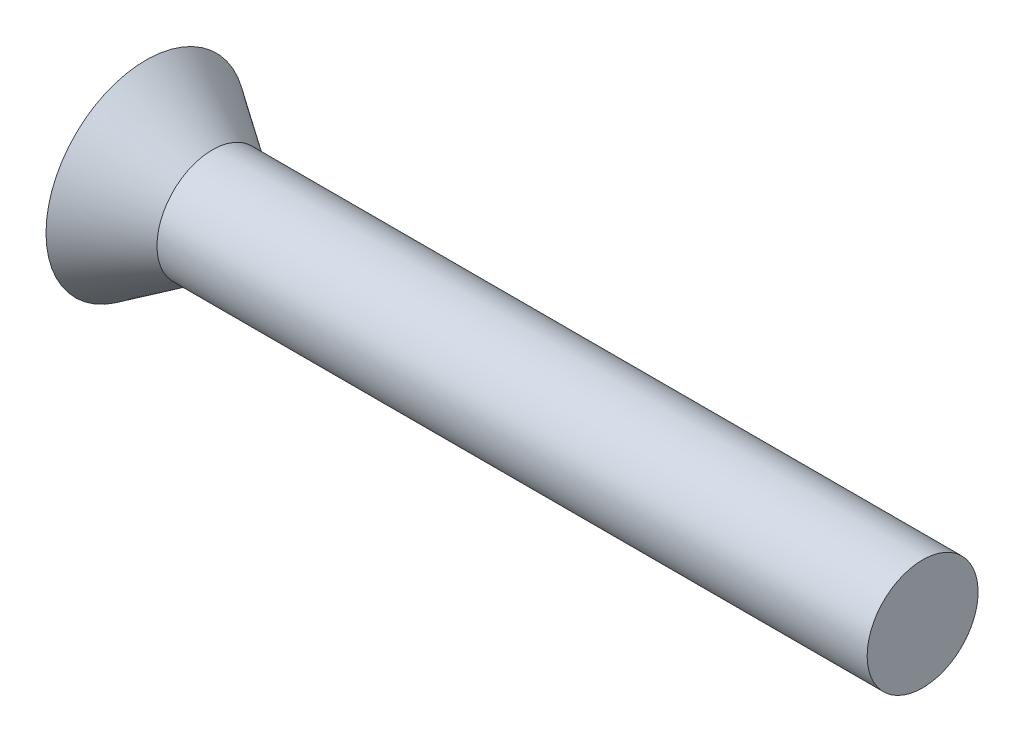
ISO-10303-21;
HEADER;
FILE_DESCRIPTION(('STEP AP214'),'2;1');
FILE_NAME('part.step','',(''),(''),'','','');
FILE_SCHEMA(('AUTOMOTIVE_DESIGN { 1 0 10303 214 1 1 1 1 }'));
ENDSEC;
DATA;
#1=APPLICATION_CONTEXT('core data for automotive mechanical design processes');
#2=APPLICATION_PROTOCOL_DEFINITION('international standard','automotive_design',2000,#1);
#3=PRODUCT_CONTEXT('',#1,'mechanical');
#4=PRODUCT('Part','Part','',(#3));
#5=PRODUCT_RELATED_PRODUCT_CATEGORY('part','',(#4));
#6=PRODUCT_DEFINITION_FORMATION('','',#4);
#7=PRODUCT_DEFINITION_CONTEXT('part definition',#1,'design');
#8=PRODUCT_DEFINITION('design','',#6,#7);
#9=PRODUCT_DEFINITION_SHAPE('','',#8);
#10=(LENGTH_UNIT() NAMED_UNIT(*) SI_UNIT(.MILLI.,.METRE.));
#11=(NAMED_UNIT(*) PLANE_ANGLE_UNIT() SI_UNIT($,.RADIAN.));
#12=(NAMED_UNIT(*) SI_UNIT($,.STERADIAN.) SOLID_ANGLE_UNIT());
#13=UNCERTAINTY_MEASURE_WITH_UNIT(LENGTH_MEASURE(1.E-05),#10,'distance_accuracy_value','');
#14=(GEOMETRIC_REPRESENTATION_CONTEXT(3) GLOBAL_UNCERTAINTY_ASSIGNED_CONTEXT((#13)) GLOBAL_UNIT_ASSIGNED_CONTEXT((#10,
#11,#12)) REPRESENTATION_CONTEXT('',''));
#15=CARTESIAN_POINT('',(0.,0.,0.));
#16=DIRECTION('',(0.,0.,1.));
#17=DIRECTION('',(1.,0.,0.));
#18=AXIS2_PLACEMENT_3D('',#15,#16,#17);
#19=CARTESIAN_POINT('',(-35.,0.,0.));
#20=DIRECTION('',(1.,0.,0.));
#21=DIRECTION('',(0.,0.,-1.));
#22=AXIS2_PLACEMENT_3D('',#19,#20,#21);
#23=PLANE('',#22);
#24=DIRECTION('',(0.,0.,1.));
#25=VECTOR('',#24,1.);
#26=CARTESIAN_POINT('',(-35.,0.5,0.));
#27=LINE('',#26,#25);
#28=CARTESIAN_POINT('',(-35.,0.5,-2.25));
#29=VERTEX_POINT('',#28);
#30=CARTESIAN_POINT('',(-35.,0.5,-0.5));
#31=VERTEX_POINT('',#30);
#32=EDGE_CURVE('E159',#29,#31,#27,.T.);
#33=ORIENTED_EDGE('',*,*,#32,.T.);
#34=DIRECTION('',(0.,-1.,0.));
#35=VECTOR('',#34,1.);
#36=CARTESIAN_POINT('',(-35.,0.,-0.5));
#37=LINE('',#36,#35);
#38=CARTESIAN_POINT('',(-35.,2.25,-0.5));
#39=VERTEX_POINT('',#38);
#40=EDGE_CURVE('E47',#39,#31,#37,.T.);
#41=ORIENTED_EDGE('',*,*,#40,.F.);
#42=DIRECTION('',(0.,0.,1.));
#43=VECTOR('',#42,1.);
#44=CARTESIAN_POINT('',(-35.,2.25,0.));
#45=LINE('',#44,#43);
#46=CARTESIAN_POINT('',(-35.,2.25,0.5));
#47=VERTEX_POINT('',#46);
#48=EDGE_CURVE('E186',#39,#47,#45,.T.);
#49=ORIENTED_EDGE('',*,*,#48,.T.);
#50=DIRECTION('',(0.,-1.,0.));
#51=VECTOR('',#50,1.);
#52=CARTESIAN_POINT('',(-35.,0.,0.5));
#53=LINE('',#52,#51);
#54=CARTESIAN_POINT('',(-35.,0.5,0.5));
#55=VERTEX_POINT('',#54);
#56=EDGE_CURVE('E184',#47,#55,#53,.T.);
#57=ORIENTED_EDGE('',*,*,#56,.T.);
#58=DIRECTION('',(0.,0.,1.));
#59=VECTOR('',#58,1.);
#60=CARTESIAN_POINT('',(-35.,0.5,0.));
#61=LINE('',#60,#59);
#62=CARTESIAN_POINT('',(-35.,0.5,2.25));
#63=VERTEX_POINT('',#62);
#64=EDGE_CURVE('E142',#55,#63,#61,.T.);
#65=ORIENTED_EDGE('',*,*,#64,.T.);
#66=DIRECTION('',(0.,-1.,0.));
#67=VECTOR('',#66,1.);
#68=CARTESIAN_POINT('',(-35.,0.,2.25));
#69=LINE('',#68,#67);
#70=CARTESIAN_POINT('',(-35.,-0.5,2.25));
#71=VERTEX_POINT('',#70);
#72=EDGE_CURVE('E180',#63,#71,#69,.T.);
#73=ORIENTED_EDGE('',*,*,#72,.T.);
#74=DIRECTION('',(0.,0.,1.));
#75=VECTOR('',#74,1.);
#76=CARTESIAN_POINT('',(-35.,-0.5,0.));
#77=LINE('',#76,#75);
#78=CARTESIAN_POINT('',(-35.,-0.5,0.5));
#79=VERTEX_POINT('',#78);
#80=EDGE_CURVE('E177',#79,#71,#77,.T.);
#81=ORIENTED_EDGE('',*,*,#80,.F.);
#82=DIRECTION('',(0.,-1.,0.));
#83=VECTOR('',#82,1.);
#84=CARTESIAN_POINT('',(-35.,0.,0.5));
#85=LINE('',#84,#83);
#86=CARTESIAN_POINT('',(-35.,-2.25,0.5));
#87=VERTEX_POINT('',#86);
#88=EDGE_CURVE('E174',#79,#87,#85,.T.);
#89=ORIENTED_EDGE('',*,*,#88,.T.);
#90=DIRECTION('',(0.,0.,1.));
#91=VECTOR('',#90,1.);
#92=CARTESIAN_POINT('',(-35.,-2.25,0.));
#93=LINE('',#92,#91);
#94=CARTESIAN_POINT('',(-35.,-2.25,-0.5));
#95=VERTEX_POINT('',#94);
#96=EDGE_CURVE('E171',#95,#87,#93,.T.);
#97=ORIENTED_EDGE('',*,*,#96,.F.);
#98=DIRECTION('',(0.,-1.,0.));
#99=VECTOR('',#98,1.);
#100=CARTESIAN_POINT('',(-35.,0.,-0.5));
#101=LINE('',#100,#99);
#102=CARTESIAN_POINT('',(-35.,-0.5,-0.5));
#103=VERTEX_POINT('',#102);
#104=EDGE_CURVE('E168',#103,#95,#101,.T.);
#105=ORIENTED_EDGE('',*,*,#104,.F.);
#106=DIRECTION('',(0.,0.,1.));
#107=VECTOR('',#106,1.);
#108=CARTESIAN_POINT('',(-35.,-0.5,0.));
#109=LINE('',#108,#107);
#110=CARTESIAN_POINT('',(-35.,-0.5,-2.25));
#111=VERTEX_POINT('',#110);
#112=EDGE_CURVE('E165',#111,#103,#109,.T.);
#113=ORIENTED_EDGE('',*,*,#112,.F.);
#114=DIRECTION('',(0.,-1.,0.));
#115=VECTOR('',#114,1.);
#116=CARTESIAN_POINT('',(-35.,0.,-2.25));
#117=LINE('',#116,#115);
#118=EDGE_CURVE('E162',#29,#111,#117,.T.);
#119=ORIENTED_EDGE('',*,*,#118,.F.);
#120=EDGE_LOOP('',(#33,#41,#49,#57,#65,#73,#81,#89,#97,#105,#113,#119));
#121=FACE_BOUND('',#120,.T.);
#122=CARTESIAN_POINT('',(-35.,0.,0.));
#123=DIRECTION('',(-1.,0.,0.));
#124=DIRECTION('',(0.,0.,1.));
#125=AXIS2_PLACEMENT_3D('',#122,#123,#124);
#126=CIRCLE('',#125,4.5);
#127=CARTESIAN_POINT('',(-35.,0.,4.5));
#128=VERTEX_POINT('',#127);
#129=EDGE_CURVE('E11',#128,#128,#126,.T.);
#130=ORIENTED_EDGE('',*,*,#129,.T.);
#131=EDGE_LOOP('',(#130));
#132=FACE_BOUND('',#131,.T.);
#133=ADVANCED_FACE('F33',(#121,#132),#23,.F.);
#134=CARTESIAN_POINT('',(-32.,0.,0.));
#135=DIRECTION('',(-1.,0.,0.));
#136=DIRECTION('',(0.,0.,1.));
#137=AXIS2_PLACEMENT_3D('',#134,#135,#136);
#138=CONICAL_SURFACE('',#137,2.5,0.588002603547567);
#139=ORIENTED_EDGE('',*,*,#129,.F.);
#140=EDGE_LOOP('',(#139));
#141=FACE_BOUND('',#140,.T.);
#142=CARTESIAN_POINT('',(-32.,0.,0.));
#143=DIRECTION('',(-1.,0.,0.));
#144=DIRECTION('',(0.,0.,1.));
#145=AXIS2_PLACEMENT_3D('',#142,#143,#144);
#146=CIRCLE('',#145,2.5);
#147=CARTESIAN_POINT('',(-32.,0.,2.5));
#148=VERTEX_POINT('',#147);
#149=EDGE_CURVE('E40',#148,#148,#146,.T.);
#150=ORIENTED_EDGE('',*,*,#149,.T.);
#151=EDGE_LOOP('',(#150));
#152=FACE_BOUND('',#151,.T.);
#153=ADVANCED_FACE('F213',(#141,#152),#138,.T.);
#154=CARTESIAN_POINT('',(-51.6305712850344,0.,0.));
#155=DIRECTION('',(-1.,0.,0.));
#156=DIRECTION('',(0.,0.,1.));
#157=AXIS2_PLACEMENT_3D('',#154,#155,#156);
#158=CYLINDRICAL_SURFACE('',#157,2.5);
#159=ORIENTED_EDGE('',*,*,#149,.F.);
#160=EDGE_LOOP('',(#159));
#161=FACE_BOUND('',#160,.T.);
#162=CARTESIAN_POINT('',(0.,0.,0.));
#163=DIRECTION('',(-1.,0.,0.));
#164=DIRECTION('',(0.,0.,1.));
#165=AXIS2_PLACEMENT_3D('',#162,#163,#164);
#166=CIRCLE('',#165,2.5);
#167=CARTESIAN_POINT('',(0.,0.,2.5));
#168=VERTEX_POINT('',#167);
#169=EDGE_CURVE('E191',#168,#168,#166,.T.);
#170=ORIENTED_EDGE('',*,*,#169,.T.);
#171=EDGE_LOOP('',(#170));
#172=FACE_BOUND('',#171,.T.);
#173=ADVANCED_FACE('F215',(#161,#172),#158,.T.);
#174=CARTESIAN_POINT('',(0.,2.5,0.));
#175=DIRECTION('',(-1.,0.,0.));
#176=DIRECTION('',(0.,0.,1.));
#177=AXIS2_PLACEMENT_3D('',#174,#175,#176);
#178=PLANE('',#177);
#179=ORIENTED_EDGE('',*,*,#169,.F.);
#180=EDGE_LOOP('',(#179));
#181=FACE_BOUND('',#180,.T.);
#182=ADVANCED_FACE('F218',(#181),#178,.F.);
#183=CARTESIAN_POINT('',(-33.,0.,-0.5));
#184=DIRECTION('',(0.,0.,-1.));
#185=DIRECTION('',(0.,1.,0.));
#186=AXIS2_PLACEMENT_3D('',#183,#184,#185);
#187=PLANE('',#186);
#188=ORIENTED_EDGE('',*,*,#40,.T.);
#189=DIRECTION('',(-1.,0.,0.));
#190=VECTOR('',#189,1.);
#191=CARTESIAN_POINT('',(-33.,0.5,-0.5));
#192=LINE('',#191,#190);
#193=CARTESIAN_POINT('',(-33.,0.5,-0.5));
#194=VERTEX_POINT('',#193);
#195=EDGE_CURVE('E157',#194,#31,#192,.T.);
#196=ORIENTED_EDGE('',*,*,#195,.F.);
#197=DIRECTION('',(0.,-1.,0.));
#198=VECTOR('',#197,1.);
#199=CARTESIAN_POINT('',(-33.,0.,-0.5));
#200=LINE('',#199,#198);
#201=CARTESIAN_POINT('',(-33.,2.25,-0.5));
#202=VERTEX_POINT('',#201);
#203=EDGE_CURVE('E189',#202,#194,#200,.T.);
#204=ORIENTED_EDGE('',*,*,#203,.F.);
#205=DIRECTION('',(-1.,0.,0.));
#206=VECTOR('',#205,1.);
#207=CARTESIAN_POINT('',(-33.,2.25,-0.5));
#208=LINE('',#207,#206);
#209=EDGE_CURVE('E55',#202,#39,#208,.T.);
#210=ORIENTED_EDGE('',*,*,#209,.T.);
#211=EDGE_LOOP('',(#188,#196,#204,#210));
#212=FACE_BOUND('',#211,.T.);
#213=ADVANCED_FACE('F223',(#212),#187,.F.);
#214=CARTESIAN_POINT('',(-33.,2.25,0.));
#215=DIRECTION('',(0.,-1.,0.));
#216=DIRECTION('',(0.,0.,-1.));
#217=AXIS2_PLACEMENT_3D('',#214,#215,#216);
#218=PLANE('',#217);
#219=ORIENTED_EDGE('',*,*,#48,.F.);
#220=ORIENTED_EDGE('',*,*,#209,.F.);
#221=DIRECTION('',(0.,0.,1.));
#222=VECTOR('',#221,1.);
#223=CARTESIAN_POINT('',(-33.,2.25,0.));
#224=LINE('',#223,#222);
#225=CARTESIAN_POINT('',(-33.,2.25,0.5));
#226=VERTEX_POINT('',#225);
#227=EDGE_CURVE('E135',#202,#226,#224,.T.);
#228=ORIENTED_EDGE('',*,*,#227,.T.);
#229=DIRECTION('',(-1.,0.,0.));
#230=VECTOR('',#229,1.);
#231=CARTESIAN_POINT('',(-33.,2.25,0.5));
#232=LINE('',#231,#230);
#233=EDGE_CURVE('E132',#226,#47,#232,.T.);
#234=ORIENTED_EDGE('',*,*,#233,.T.);
#235=EDGE_LOOP('',(#219,#220,#228,#234));
#236=FACE_BOUND('',#235,.T.);
#237=ADVANCED_FACE('F228',(#236),#218,.T.);
#238=CARTESIAN_POINT('',(-33.,0.,0.5));
#239=DIRECTION('',(0.,0.,-1.));
#240=DIRECTION('',(0.,1.,0.));
#241=AXIS2_PLACEMENT_3D('',#238,#239,#240);
#242=PLANE('',#241);
#243=ORIENTED_EDGE('',*,*,#56,.F.);
#244=ORIENTED_EDGE('',*,*,#233,.F.);
#245=DIRECTION('',(0.,-1.,0.));
#246=VECTOR('',#245,1.);
#247=CARTESIAN_POINT('',(-33.,0.,0.5));
#248=LINE('',#247,#246);
#249=CARTESIAN_POINT('',(-33.,0.5,0.5));
#250=VERTEX_POINT('',#249);
#251=EDGE_CURVE('E126',#226,#250,#248,.T.);
#252=ORIENTED_EDGE('',*,*,#251,.T.);
#253=DIRECTION('',(-1.,0.,0.));
#254=VECTOR('',#253,1.);
#255=CARTESIAN_POINT('',(-33.,0.5,0.5));
#256=LINE('',#255,#254);
#257=EDGE_CURVE('E130',#250,#55,#256,.T.);
#258=ORIENTED_EDGE('',*,*,#257,.T.);
#259=EDGE_LOOP('',(#243,#244,#252,#258));
#260=FACE_BOUND('',#259,.T.);
#261=ADVANCED_FACE('F129',(#260),#242,.T.);
#262=CARTESIAN_POINT('',(-33.,0.5,0.));
#263=DIRECTION('',(0.,-1.,0.));
#264=DIRECTION('',(0.,0.,-1.));
#265=AXIS2_PLACEMENT_3D('',#262,#263,#264);
#266=PLANE('',#265);
#267=ORIENTED_EDGE('',*,*,#64,.F.);
#268=ORIENTED_EDGE('',*,*,#257,.F.);
#269=DIRECTION('',(0.,0.,1.));
#270=VECTOR('',#269,1.);
#271=CARTESIAN_POINT('',(-33.,0.5,0.));
#272=LINE('',#271,#270);
#273=CARTESIAN_POINT('',(-33.,0.5,2.25));
#274=VERTEX_POINT('',#273);
#275=EDGE_CURVE('E136',#250,#274,#272,.T.);
#276=ORIENTED_EDGE('',*,*,#275,.T.);
#277=DIRECTION('',(-1.,0.,0.));
#278=VECTOR('',#277,1.);
#279=CARTESIAN_POINT('',(-33.,0.5,2.25));
#280=LINE('',#279,#278);
#281=EDGE_CURVE('E144',#274,#63,#280,.T.);
#282=ORIENTED_EDGE('',*,*,#281,.T.);
#283=EDGE_LOOP('',(#267,#268,#276,#282));
#284=FACE_BOUND('',#283,.T.);
#285=ADVANCED_FACE('F139',(#284),#266,.T.);
#286=CARTESIAN_POINT('',(-33.,0.,2.25));
#287=DIRECTION('',(0.,0.,-1.));
#288=DIRECTION('',(-1.,0.,0.));
#289=AXIS2_PLACEMENT_3D('',#286,#287,#288);
#290=PLANE('',#289);
#291=ORIENTED_EDGE('',*,*,#72,.F.);
#292=ORIENTED_EDGE('',*,*,#281,.F.);
#293=DIRECTION('',(0.,-1.,0.));
#294=VECTOR('',#293,1.);
#295=CARTESIAN_POINT('',(-33.,0.,2.25));
#296=LINE('',#295,#294);
#297=CARTESIAN_POINT('',(-33.,-0.5,2.25));
#298=VERTEX_POINT('',#297);
#299=EDGE_CURVE('E150',#274,#298,#296,.T.);
#300=ORIENTED_EDGE('',*,*,#299,.T.);
#301=DIRECTION('',(-1.,0.,0.));
#302=VECTOR('',#301,1.);
#303=CARTESIAN_POINT('',(-33.,-0.5,2.25));
#304=LINE('',#303,#302);
#305=EDGE_CURVE('E194',#298,#71,#304,.T.);
#306=ORIENTED_EDGE('',*,*,#305,.T.);
#307=EDGE_LOOP('',(#291,#292,#300,#306));
#308=FACE_BOUND('',#307,.T.);
#309=ADVANCED_FACE('F268',(#308),#290,.T.);
#310=CARTESIAN_POINT('',(-33.,-0.5,0.));
#311=DIRECTION('',(0.,-1.,0.));
#312=DIRECTION('',(0.,0.,-1.));
#313=AXIS2_PLACEMENT_3D('',#310,#311,#312);
#314=PLANE('',#313);
#315=ORIENTED_EDGE('',*,*,#80,.T.);
#316=ORIENTED_EDGE('',*,*,#305,.F.);
#317=DIRECTION('',(0.,0.,1.));
#318=VECTOR('',#317,1.);
#319=CARTESIAN_POINT('',(-33.,-0.5,0.));
#320=LINE('',#319,#318);
#321=CARTESIAN_POINT('',(-33.,-0.5,0.5));
#322=VERTEX_POINT('',#321);
#323=EDGE_CURVE('E152',#322,#298,#320,.T.);
#324=ORIENTED_EDGE('',*,*,#323,.F.);
#325=DIRECTION('',(-1.,0.,0.));
#326=VECTOR('',#325,1.);
#327=CARTESIAN_POINT('',(-33.,-0.5,0.5));
#328=LINE('',#327,#326);
#329=EDGE_CURVE('E196',#322,#79,#328,.T.);
#330=ORIENTED_EDGE('',*,*,#329,.T.);
#331=EDGE_LOOP('',(#315,#316,#324,#330));
#332=FACE_BOUND('',#331,.T.);
#333=ADVANCED_FACE('F263',(#332),#314,.F.);
#334=CARTESIAN_POINT('',(-33.,0.,0.5));
#335=DIRECTION('',(0.,0.,-1.));
#336=DIRECTION('',(0.,1.,0.));
#337=AXIS2_PLACEMENT_3D('',#334,#335,#336);
#338=PLANE('',#337);
#339=ORIENTED_EDGE('',*,*,#88,.F.);
#340=ORIENTED_EDGE('',*,*,#329,.F.);
#341=DIRECTION('',(0.,-1.,0.));
#342=VECTOR('',#341,1.);
#343=CARTESIAN_POINT('',(-33.,0.,0.5));
#344=LINE('',#343,#342);
#345=CARTESIAN_POINT('',(-33.,-2.25,0.5));
#346=VERTEX_POINT('',#345);
#347=EDGE_CURVE('E258',#322,#346,#344,.T.);
#348=ORIENTED_EDGE('',*,*,#347,.T.);
#349=DIRECTION('',(-1.,0.,0.));
#350=VECTOR('',#349,1.);
#351=CARTESIAN_POINT('',(-33.,-2.25,0.5));
#352=LINE('',#351,#350);
#353=EDGE_CURVE('E198',#346,#87,#352,.T.);
#354=ORIENTED_EDGE('',*,*,#353,.T.);
#355=EDGE_LOOP('',(#339,#340,#348,#354));
#356=FACE_BOUND('',#355,.T.);
#357=ADVANCED_FACE('F283',(#356),#338,.T.);
#358=CARTESIAN_POINT('',(-33.,-2.25,0.));
#359=DIRECTION('',(0.,-1.,0.));
#360=DIRECTION('',(0.,0.,-1.));
#361=AXIS2_PLACEMENT_3D('',#358,#359,#360);
#362=PLANE('',#361);
#363=ORIENTED_EDGE('',*,*,#96,.T.);
#364=ORIENTED_EDGE('',*,*,#353,.F.);
#365=DIRECTION('',(0.,0.,1.));
#366=VECTOR('',#365,1.);
#367=CARTESIAN_POINT('',(-33.,-2.25,0.));
#368=LINE('',#367,#366);
#369=CARTESIAN_POINT('',(-33.,-2.25,-0.5));
#370=VERTEX_POINT('',#369);
#371=EDGE_CURVE('E255',#370,#346,#368,.T.);
#372=ORIENTED_EDGE('',*,*,#371,.F.);
#373=DIRECTION('',(-1.,0.,0.));
#374=VECTOR('',#373,1.);
#375=CARTESIAN_POINT('',(-33.,-2.25,-0.5));
#376=LINE('',#375,#374);
#377=EDGE_CURVE('E200',#370,#95,#376,.T.);
#378=ORIENTED_EDGE('',*,*,#377,.T.);
#379=EDGE_LOOP('',(#363,#364,#372,#378));
#380=FACE_BOUND('',#379,.T.);
#381=ADVANCED_FACE('F286',(#380),#362,.F.);
#382=CARTESIAN_POINT('',(-33.,0.,-0.5));
#383=DIRECTION('',(0.,0.,-1.));
#384=DIRECTION('',(0.,1.,0.));
#385=AXIS2_PLACEMENT_3D('',#382,#383,#384);
#386=PLANE('',#385);
#387=ORIENTED_EDGE('',*,*,#104,.T.);
#388=ORIENTED_EDGE('',*,*,#377,.F.);
#389=DIRECTION('',(0.,-1.,0.));
#390=VECTOR('',#389,1.);
#391=CARTESIAN_POINT('',(-33.,0.,-0.5));
#392=LINE('',#391,#390);
#393=CARTESIAN_POINT('',(-33.,-0.5,-0.5));
#394=VERTEX_POINT('',#393);
#395=EDGE_CURVE('E252',#394,#370,#392,.T.);
#396=ORIENTED_EDGE('',*,*,#395,.F.);
#397=DIRECTION('',(-1.,0.,0.));
#398=VECTOR('',#397,1.);
#399=CARTESIAN_POINT('',(-33.,-0.5,-0.5));
#400=LINE('',#399,#398);
#401=EDGE_CURVE('E202',#394,#103,#400,.T.);
#402=ORIENTED_EDGE('',*,*,#401,.T.);
#403=EDGE_LOOP('',(#387,#388,#396,#402));
#404=FACE_BOUND('',#403,.T.);
#405=ADVANCED_FACE('F290',(#404),#386,.F.);
#406=CARTESIAN_POINT('',(-33.,-0.5,0.));
#407=DIRECTION('',(0.,-1.,0.));
#408=DIRECTION('',(0.,0.,-1.));
#409=AXIS2_PLACEMENT_3D('',#406,#407,#408);
#410=PLANE('',#409);
#411=ORIENTED_EDGE('',*,*,#112,.T.);
#412=ORIENTED_EDGE('',*,*,#401,.F.);
#413=DIRECTION('',(0.,0.,1.));
#414=VECTOR('',#413,1.);
#415=CARTESIAN_POINT('',(-33.,-0.5,0.));
#416=LINE('',#415,#414);
#417=CARTESIAN_POINT('',(-33.,-0.5,-2.25));
#418=VERTEX_POINT('',#417);
#419=EDGE_CURVE('E249',#418,#394,#416,.T.);
#420=ORIENTED_EDGE('',*,*,#419,.F.);
#421=DIRECTION('',(-1.,0.,0.));
#422=VECTOR('',#421,1.);
#423=CARTESIAN_POINT('',(-33.,-0.5,-2.25));
#424=LINE('',#423,#422);
#425=EDGE_CURVE('E204',#418,#111,#424,.T.);
#426=ORIENTED_EDGE('',*,*,#425,.T.);
#427=EDGE_LOOP('',(#411,#412,#420,#426));
#428=FACE_BOUND('',#427,.T.);
#429=ADVANCED_FACE('F294',(#428),#410,.F.);
#430=CARTESIAN_POINT('',(-33.,0.,-2.25));
#431=DIRECTION('',(0.,0.,-1.));
#432=DIRECTION('',(-1.,0.,0.));
#433=AXIS2_PLACEMENT_3D('',#430,#431,#432);
#434=PLANE('',#433);
#435=ORIENTED_EDGE('',*,*,#118,.T.);
#436=ORIENTED_EDGE('',*,*,#425,.F.);
#437=DIRECTION('',(0.,-1.,0.));
#438=VECTOR('',#437,1.);
#439=CARTESIAN_POINT('',(-33.,0.,-2.25));
#440=LINE('',#439,#438);
#441=CARTESIAN_POINT('',(-33.,0.5,-2.25));
#442=VERTEX_POINT('',#441);
#443=EDGE_CURVE('E245',#442,#418,#440,.T.);
#444=ORIENTED_EDGE('',*,*,#443,.F.);
#445=DIRECTION('',(-1.,0.,0.));
#446=VECTOR('',#445,1.);
#447=CARTESIAN_POINT('',(-33.,0.5,-2.25));
#448=LINE('',#447,#446);
#449=EDGE_CURVE('E206',#442,#29,#448,.T.);
#450=ORIENTED_EDGE('',*,*,#449,.T.);
#451=EDGE_LOOP('',(#435,#436,#444,#450));
#452=FACE_BOUND('',#451,.T.);
#453=ADVANCED_FACE('F298',(#452),#434,.F.);
#454=CARTESIAN_POINT('',(-33.,0.5,0.));
#455=DIRECTION('',(0.,-1.,0.));
#456=DIRECTION('',(0.,0.,-1.));
#457=AXIS2_PLACEMENT_3D('',#454,#455,#456);
#458=PLANE('',#457);
#459=ORIENTED_EDGE('',*,*,#32,.F.);
#460=ORIENTED_EDGE('',*,*,#449,.F.);
#461=DIRECTION('',(0.,0.,1.));
#462=VECTOR('',#461,1.);
#463=CARTESIAN_POINT('',(-33.,0.5,0.));
#464=LINE('',#463,#462);
#465=EDGE_CURVE('E99',#442,#194,#464,.T.);
#466=ORIENTED_EDGE('',*,*,#465,.T.);
#467=ORIENTED_EDGE('',*,*,#195,.T.);
#468=EDGE_LOOP('',(#459,#460,#466,#467));
#469=FACE_BOUND('',#468,.T.);
#470=ADVANCED_FACE('F241',(#469),#458,.T.);
#471=CARTESIAN_POINT('',(-33.,0.,0.));
#472=DIRECTION('',(-1.,0.,0.));
#473=DIRECTION('',(0.,0.,1.));
#474=AXIS2_PLACEMENT_3D('',#471,#472,#473);
#475=PLANE('',#474);
#476=ORIENTED_EDGE('',*,*,#203,.T.);
#477=ORIENTED_EDGE('',*,*,#465,.F.);
#478=ORIENTED_EDGE('',*,*,#443,.T.);
#479=ORIENTED_EDGE('',*,*,#419,.T.);
#480=ORIENTED_EDGE('',*,*,#395,.T.);
#481=ORIENTED_EDGE('',*,*,#371,.T.);
#482=ORIENTED_EDGE('',*,*,#347,.F.);
#483=ORIENTED_EDGE('',*,*,#323,.T.);
#484=ORIENTED_EDGE('',*,*,#299,.F.);
#485=ORIENTED_EDGE('',*,*,#275,.F.);
#486=ORIENTED_EDGE('',*,*,#251,.F.);
#487=ORIENTED_EDGE('',*,*,#227,.F.);
#488=EDGE_LOOP('',(#476,#477,#478,#479,#480,#481,#482,#483,#484,#485,#486,#487));
#489=FACE_BOUND('',#488,.T.);
#490=ADVANCED_FACE('F148',(#489),#475,.T.);
#491=CLOSED_SHELL('',(#133,#153,#173,#182,#213,#237,#261,#285,#309,#333,#357,#381,#405,#429,
#453,#470,#490));
#492=MANIFOLD_SOLID_BREP('B2',#491);
#493=ADVANCED_BREP_SHAPE_REPRESENTATION('',(#18,#492),#14);
#494=SHAPE_DEFINITION_REPRESENTATION(#9,#493);
ENDSEC;
END-ISO-10303-21;
